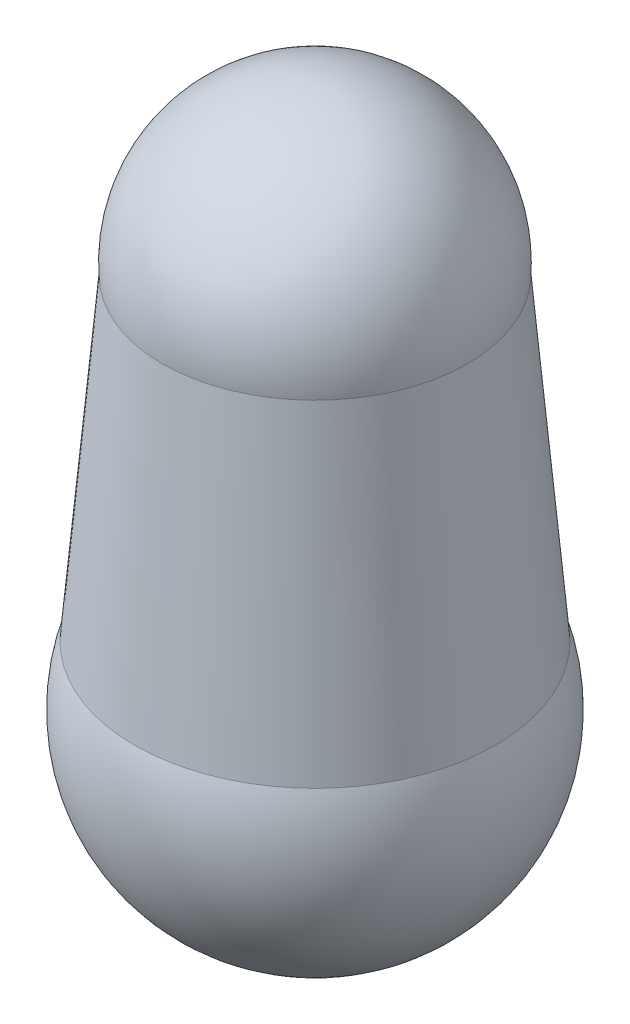
ISO-10303-21;
HEADER;
FILE_DESCRIPTION(('STEP AP214'),'2;1');
FILE_NAME('part.step','',(''),(''),'','','');
FILE_SCHEMA(('AUTOMOTIVE_DESIGN { 1 0 10303 214 1 1 1 1 }'));
ENDSEC;
DATA;
#1=APPLICATION_CONTEXT('core data for automotive mechanical design processes');
#2=APPLICATION_PROTOCOL_DEFINITION('international standard','automotive_design',2000,#1);
#3=PRODUCT_CONTEXT('',#1,'mechanical');
#4=PRODUCT('Part','Part','',(#3));
#5=PRODUCT_RELATED_PRODUCT_CATEGORY('part','',(#4));
#6=PRODUCT_DEFINITION_FORMATION('','',#4);
#7=PRODUCT_DEFINITION_CONTEXT('part definition',#1,'design');
#8=PRODUCT_DEFINITION('design','',#6,#7);
#9=PRODUCT_DEFINITION_SHAPE('','',#8);
#10=(LENGTH_UNIT() NAMED_UNIT(*) SI_UNIT(.MILLI.,.METRE.));
#11=(NAMED_UNIT(*) PLANE_ANGLE_UNIT() SI_UNIT($,.RADIAN.));
#12=(NAMED_UNIT(*) SI_UNIT($,.STERADIAN.) SOLID_ANGLE_UNIT());
#13=UNCERTAINTY_MEASURE_WITH_UNIT(LENGTH_MEASURE(1.E-05),#10,'distance_accuracy_value','');
#14=(GEOMETRIC_REPRESENTATION_CONTEXT(3) GLOBAL_UNCERTAINTY_ASSIGNED_CONTEXT((#13)) GLOBAL_UNIT_ASSIGNED_CONTEXT((#10,
#11,#12)) REPRESENTATION_CONTEXT('',''));
#15=CARTESIAN_POINT('',(0.,0.,0.));
#16=DIRECTION('',(0.,0.,1.));
#17=DIRECTION('',(1.,0.,0.));
#18=AXIS2_PLACEMENT_3D('',#15,#16,#17);
#19=CARTESIAN_POINT('',(0.,0.,0.));
#20=DIRECTION('',(0.,-1.,0.));
#21=DIRECTION('',(0.,0.,1.));
#22=AXIS2_PLACEMENT_3D('',#19,#20,#21);
#23=CONICAL_SURFACE('',#22,4.78893591718068,0.0872664625997165);
#24=CARTESIAN_POINT('',(0.,1.52970887540964,0.));
#25=DIRECTION('',(0.,-1.,0.));
#26=DIRECTION('',(0.,0.,-1.));
#27=AXIS2_PLACEMENT_3D('',#24,#25,#26);
#28=CIRCLE('',#27,4.65510373208734);
#29=CARTESIAN_POINT('',(0.,1.52970887540964,-4.65510373208734));
#30=VERTEX_POINT('',#29);
#31=EDGE_CURVE('E37',#30,#30,#28,.F.);
#32=ORIENTED_EDGE('',*,*,#31,.T.);
#33=EDGE_LOOP('',(#32));
#34=FACE_BOUND('',#33,.T.);
#35=CARTESIAN_POINT('',(0.,9.70183180670292,0.));
#36=DIRECTION('',(0.,1.,0.));
#37=DIRECTION('',(0.,0.,1.));
#38=AXIS2_PLACEMENT_3D('',#35,#36,#37);
#39=CIRCLE('',#38,3.94013561865894);
#40=CARTESIAN_POINT('',(0.,9.70183180670292,3.94013561865894));
#41=VERTEX_POINT('',#40);
#42=EDGE_CURVE('E10',#41,#41,#39,.T.);
#43=ORIENTED_EDGE('',*,*,#42,.F.);
#44=EDGE_LOOP('',(#43));
#45=FACE_BOUND('',#44,.T.);
#46=ADVANCED_FACE('F30',(#34,#45),#23,.T.);
#47=CARTESIAN_POINT('',(0.,0.,0.));
#48=DIRECTION('',(0.,0.,-1.));
#49=DIRECTION('',(1.,0.,0.));
#50=AXIS2_PLACEMENT_3D('',#47,#48,#49);
#51=SPHERICAL_SURFACE('',#50,4.9);
#52=CARTESIAN_POINT('',(0.,0.,0.));
#53=DIRECTION('',(0.,-1.,0.));
#54=DIRECTION('',(0.,0.,-1.));
#55=AXIS2_PLACEMENT_3D('',#52,#53,#54);
#56=SPHERICAL_SURFACE('',#55,4.9);
#57=ORIENTED_EDGE('',*,*,#31,.F.);
#58=EDGE_LOOP('',(#57));
#59=FACE_BOUND('',#58,.T.);
#60=ADVANCED_FACE('F32',(#59),#56,.T.);
#61=CARTESIAN_POINT('',(0.,10.,0.));
#62=DIRECTION('',(0.,0.,-1.));
#63=DIRECTION('',(1.,0.,0.));
#64=AXIS2_PLACEMENT_3D('',#61,#62,#63);
#65=SPHERICAL_SURFACE('',#64,3.95140139253388);
#66=CARTESIAN_POINT('',(0.,10.,0.));
#67=DIRECTION('',(0.,1.,0.));
#68=DIRECTION('',(0.,0.,1.));
#69=AXIS2_PLACEMENT_3D('',#66,#67,#68);
#70=SPHERICAL_SURFACE('',#69,3.95140139253388);
#71=ORIENTED_EDGE('',*,*,#42,.T.);
#72=EDGE_LOOP('',(#71));
#73=FACE_BOUND('',#72,.T.);
#74=ADVANCED_FACE('F46',(#73),#70,.T.);
#75=CLOSED_SHELL('',(#46,#60,#74));
#76=MANIFOLD_SOLID_BREP('B2',#75);
#77=ADVANCED_BREP_SHAPE_REPRESENTATION('',(#18,#76),#14);
#78=SHAPE_DEFINITION_REPRESENTATION(#9,#77);
ENDSEC;
END-ISO-10303-21;
